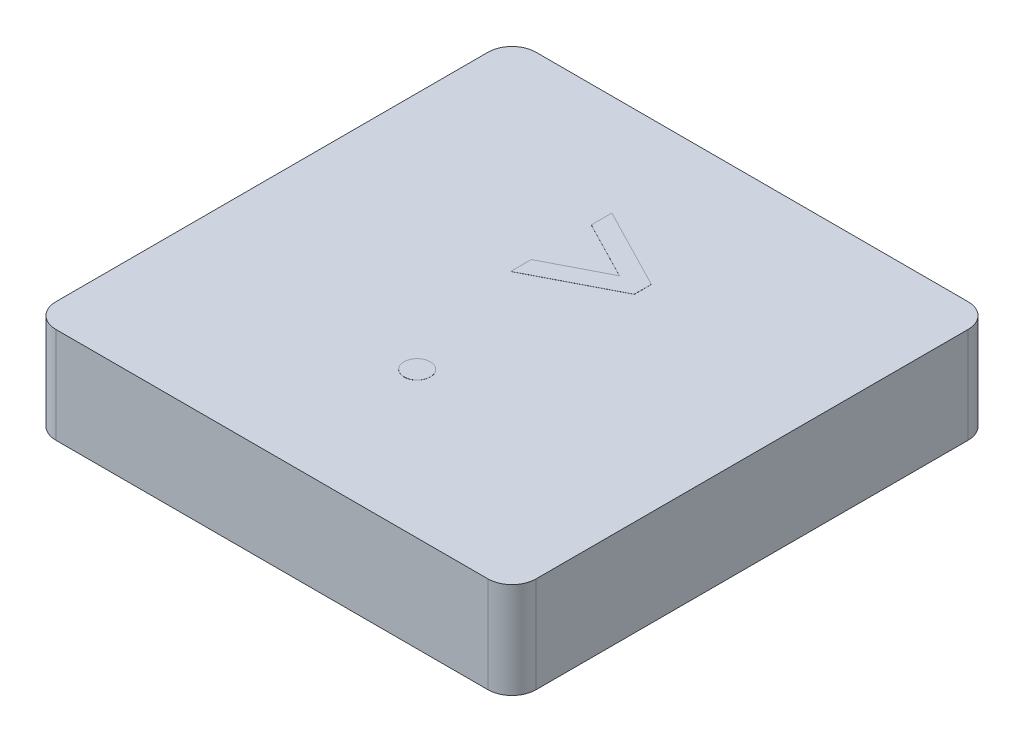
ISO-10303-21;
HEADER;
FILE_DESCRIPTION(('STEP AP214'),'2;1');
FILE_NAME('part.step','',(''),(''),'','','');
FILE_SCHEMA(('AUTOMOTIVE_DESIGN { 1 0 10303 214 1 1 1 1 }'));
ENDSEC;
DATA;
#1=APPLICATION_CONTEXT('core data for automotive mechanical design processes');
#2=APPLICATION_PROTOCOL_DEFINITION('international standard','automotive_design',2000,#1);
#3=PRODUCT_CONTEXT('',#1,'mechanical');
#4=PRODUCT('Part','Part','',(#3));
#5=PRODUCT_RELATED_PRODUCT_CATEGORY('part','',(#4));
#6=PRODUCT_DEFINITION_FORMATION('','',#4);
#7=PRODUCT_DEFINITION_CONTEXT('part definition',#1,'design');
#8=PRODUCT_DEFINITION('design','',#6,#7);
#9=PRODUCT_DEFINITION_SHAPE('','',#8);
#10=(LENGTH_UNIT() NAMED_UNIT(*) SI_UNIT(.MILLI.,.METRE.));
#11=(NAMED_UNIT(*) PLANE_ANGLE_UNIT() SI_UNIT($,.RADIAN.));
#12=(NAMED_UNIT(*) SI_UNIT($,.STERADIAN.) SOLID_ANGLE_UNIT());
#13=UNCERTAINTY_MEASURE_WITH_UNIT(LENGTH_MEASURE(1.E-05),#10,'distance_accuracy_value','');
#14=(GEOMETRIC_REPRESENTATION_CONTEXT(3) GLOBAL_UNCERTAINTY_ASSIGNED_CONTEXT((#13)) GLOBAL_UNIT_ASSIGNED_CONTEXT((#10,
#11,#12)) REPRESENTATION_CONTEXT('',''));
#15=CARTESIAN_POINT('',(0.,0.,0.));
#16=DIRECTION('',(0.,0.,1.));
#17=DIRECTION('',(1.,0.,0.));
#18=AXIS2_PLACEMENT_3D('',#15,#16,#17);
#19=CARTESIAN_POINT('',(0.,2.54,-12.7));
#20=DIRECTION('',(1.,0.,0.));
#21=DIRECTION('',(0.,0.,-1.));
#22=AXIS2_PLACEMENT_3D('',#19,#20,#21);
#23=PLANE('',#22);
#24=DIRECTION('',(0.,0.,1.));
#25=VECTOR('',#24,1.);
#26=CARTESIAN_POINT('',(0.,2.54,-12.7));
#27=LINE('',#26,#25);
#28=CARTESIAN_POINT('',(0.,2.54,-12.065));
#29=VERTEX_POINT('',#28);
#30=CARTESIAN_POINT('',(0.,2.54,-0.635));
#31=VERTEX_POINT('',#30);
#32=EDGE_CURVE('E361',#29,#31,#27,.T.);
#33=ORIENTED_EDGE('',*,*,#32,.F.);
#34=DIRECTION('',(0.,-1.,0.));
#35=VECTOR('',#34,1.);
#36=CARTESIAN_POINT('',(0.,2.54,-12.065));
#37=LINE('',#36,#35);
#38=CARTESIAN_POINT('',(0.,0.,-12.065));
#39=VERTEX_POINT('',#38);
#40=EDGE_CURVE('E382',#29,#39,#37,.T.);
#41=ORIENTED_EDGE('',*,*,#40,.T.);
#42=DIRECTION('',(0.,0.,1.));
#43=VECTOR('',#42,1.);
#44=CARTESIAN_POINT('',(0.,0.,-12.7));
#45=LINE('',#44,#43);
#46=CARTESIAN_POINT('',(0.,0.,-0.635));
#47=VERTEX_POINT('',#46);
#48=EDGE_CURVE('E371',#39,#47,#45,.T.);
#49=ORIENTED_EDGE('',*,*,#48,.T.);
#50=DIRECTION('',(0.,-1.,0.));
#51=VECTOR('',#50,1.);
#52=CARTESIAN_POINT('',(0.,2.54,-0.635));
#53=LINE('',#52,#51);
#54=EDGE_CURVE('E370',#47,#31,#53,.F.);
#55=ORIENTED_EDGE('',*,*,#54,.T.);
#56=EDGE_LOOP('',(#33,#41,#49,#55));
#57=FACE_BOUND('',#56,.T.);
#58=ADVANCED_FACE('F33',(#57),#23,.F.);
#59=CARTESIAN_POINT('',(0.,2.54,0.));
#60=DIRECTION('',(0.,0.,-1.));
#61=DIRECTION('',(-1.,0.,0.));
#62=AXIS2_PLACEMENT_3D('',#59,#60,#61);
#63=PLANE('',#62);
#64=DIRECTION('',(1.,0.,0.));
#65=VECTOR('',#64,1.);
#66=CARTESIAN_POINT('',(0.,0.,0.));
#67=LINE('',#66,#65);
#68=CARTESIAN_POINT('',(0.635,0.,0.));
#69=VERTEX_POINT('',#68);
#70=CARTESIAN_POINT('',(12.065,0.,0.));
#71=VERTEX_POINT('',#70);
#72=EDGE_CURVE('E356',#69,#71,#67,.T.);
#73=ORIENTED_EDGE('',*,*,#72,.T.);
#74=DIRECTION('',(0.,-1.,0.));
#75=VECTOR('',#74,1.);
#76=CARTESIAN_POINT('',(12.065,2.54,0.));
#77=LINE('',#76,#75);
#78=CARTESIAN_POINT('',(12.065,2.54,0.));
#79=VERTEX_POINT('',#78);
#80=EDGE_CURVE('E41',#71,#79,#77,.F.);
#81=ORIENTED_EDGE('',*,*,#80,.T.);
#82=DIRECTION('',(1.,0.,0.));
#83=VECTOR('',#82,1.);
#84=CARTESIAN_POINT('',(0.,2.54,0.));
#85=LINE('',#84,#83);
#86=CARTESIAN_POINT('',(0.635,2.54,0.));
#87=VERTEX_POINT('',#86);
#88=EDGE_CURVE('E353',#87,#79,#85,.T.);
#89=ORIENTED_EDGE('',*,*,#88,.F.);
#90=DIRECTION('',(0.,-1.,0.));
#91=VECTOR('',#90,1.);
#92=CARTESIAN_POINT('',(0.635,2.54,0.));
#93=LINE('',#92,#91);
#94=EDGE_CURVE('E349',#87,#69,#93,.T.);
#95=ORIENTED_EDGE('',*,*,#94,.T.);
#96=EDGE_LOOP('',(#73,#81,#89,#95));
#97=FACE_BOUND('',#96,.T.);
#98=ADVANCED_FACE('F305',(#97),#63,.F.);
#99=CARTESIAN_POINT('',(12.7,2.54,0.));
#100=DIRECTION('',(-1.,0.,0.));
#101=DIRECTION('',(0.,0.,1.));
#102=AXIS2_PLACEMENT_3D('',#99,#100,#101);
#103=PLANE('',#102);
#104=DIRECTION('',(0.,0.,-1.));
#105=VECTOR('',#104,1.);
#106=CARTESIAN_POINT('',(12.7,0.,0.));
#107=LINE('',#106,#105);
#108=CARTESIAN_POINT('',(12.7,0.,-0.635));
#109=VERTEX_POINT('',#108);
#110=CARTESIAN_POINT('',(12.7,0.,-12.065));
#111=VERTEX_POINT('',#110);
#112=EDGE_CURVE('E376',#109,#111,#107,.T.);
#113=ORIENTED_EDGE('',*,*,#112,.T.);
#114=DIRECTION('',(0.,-1.,0.));
#115=VECTOR('',#114,1.);
#116=CARTESIAN_POINT('',(12.7,2.54,-12.065));
#117=LINE('',#116,#115);
#118=CARTESIAN_POINT('',(12.7,2.54,-12.065));
#119=VERTEX_POINT('',#118);
#120=EDGE_CURVE('E347',#111,#119,#117,.F.);
#121=ORIENTED_EDGE('',*,*,#120,.T.);
#122=DIRECTION('',(0.,0.,-1.));
#123=VECTOR('',#122,1.);
#124=CARTESIAN_POINT('',(12.7,2.54,0.));
#125=LINE('',#124,#123);
#126=CARTESIAN_POINT('',(12.7,2.54,-0.635));
#127=VERTEX_POINT('',#126);
#128=EDGE_CURVE('E360',#127,#119,#125,.T.);
#129=ORIENTED_EDGE('',*,*,#128,.F.);
#130=DIRECTION('',(0.,-1.,0.));
#131=VECTOR('',#130,1.);
#132=CARTESIAN_POINT('',(12.7,2.54,-0.635));
#133=LINE('',#132,#131);
#134=EDGE_CURVE('E331',#127,#109,#133,.T.);
#135=ORIENTED_EDGE('',*,*,#134,.T.);
#136=EDGE_LOOP('',(#113,#121,#129,#135));
#137=FACE_BOUND('',#136,.T.);
#138=ADVANCED_FACE('F301',(#137),#103,.F.);
#139=CARTESIAN_POINT('',(12.7,2.54,-12.7));
#140=DIRECTION('',(0.,0.,1.));
#141=DIRECTION('',(1.,0.,0.));
#142=AXIS2_PLACEMENT_3D('',#139,#140,#141);
#143=PLANE('',#142);
#144=DIRECTION('',(-1.,0.,0.));
#145=VECTOR('',#144,1.);
#146=CARTESIAN_POINT('',(12.7,0.,-12.7));
#147=LINE('',#146,#145);
#148=CARTESIAN_POINT('',(12.065,0.,-12.7));
#149=VERTEX_POINT('',#148);
#150=CARTESIAN_POINT('',(0.634999999999995,0.,-12.7));
#151=VERTEX_POINT('',#150);
#152=EDGE_CURVE('E365',#149,#151,#147,.T.);
#153=ORIENTED_EDGE('',*,*,#152,.T.);
#154=DIRECTION('',(0.,-1.,0.));
#155=VECTOR('',#154,1.);
#156=CARTESIAN_POINT('',(0.634999999999995,2.54,-12.7));
#157=LINE('',#156,#155);
#158=CARTESIAN_POINT('',(0.634999999999995,2.54,-12.7));
#159=VERTEX_POINT('',#158);
#160=EDGE_CURVE('E341',#151,#159,#157,.F.);
#161=ORIENTED_EDGE('',*,*,#160,.T.);
#162=DIRECTION('',(-1.,0.,0.));
#163=VECTOR('',#162,1.);
#164=CARTESIAN_POINT('',(12.7,2.54,-12.7));
#165=LINE('',#164,#163);
#166=CARTESIAN_POINT('',(12.065,2.54,-12.7));
#167=VERTEX_POINT('',#166);
#168=EDGE_CURVE('E363',#167,#159,#165,.T.);
#169=ORIENTED_EDGE('',*,*,#168,.F.);
#170=DIRECTION('',(0.,-1.,0.));
#171=VECTOR('',#170,1.);
#172=CARTESIAN_POINT('',(12.065,2.54,-12.7));
#173=LINE('',#172,#171);
#174=EDGE_CURVE('E393',#167,#149,#173,.T.);
#175=ORIENTED_EDGE('',*,*,#174,.T.);
#176=EDGE_LOOP('',(#153,#161,#169,#175));
#177=FACE_BOUND('',#176,.T.);
#178=ADVANCED_FACE('F294',(#177),#143,.F.);
#179=CARTESIAN_POINT('',(0.,2.54,0.));
#180=DIRECTION('',(0.,1.,0.));
#181=DIRECTION('',(0.,0.,1.));
#182=AXIS2_PLACEMENT_3D('',#179,#180,#181);
#183=PLANE('',#182);
#184=CARTESIAN_POINT('',(5.98463076923076,2.54,-3.86256049679487));
#185=CARTESIAN_POINT('',(5.98575091221305,2.54,-3.88582365414126));
#186=CARTESIAN_POINT('',(5.98793947068879,2.54,-3.93127569105815));
#187=CARTESIAN_POINT('',(6.00822733864156,2.54,-3.99624890744085));
#188=CARTESIAN_POINT('',(6.03959142315948,2.54,-4.05621517679641));
#189=CARTESIAN_POINT('',(6.08444342926258,2.54,-4.10822492029485));
#190=CARTESIAN_POINT('',(6.13726718656445,2.54,-4.15192679149887));
#191=CARTESIAN_POINT('',(6.19676588491166,2.54,-4.18484198105881));
#192=CARTESIAN_POINT('',(6.26231006703648,2.54,-4.20356641951964));
#193=CARTESIAN_POINT('',(6.30761382812563,2.54,-4.20603050264023));
#194=CARTESIAN_POINT('',(6.33062435897435,2.54,-4.20728205128205));
#195=B_SPLINE_CURVE_WITH_KNOTS('',3,(#184,#185,#186,#187,#188,#189,#190,#191,#192,#193,#194),
.UNSPECIFIED.,.F.,.F.,(4,1,1,1,1,1,1,1,4),(0.,0.128226026866841,0.250530657557688,
0.372638769720387,0.499833212026497,0.627178614218926,0.749841778857928,0.872940494866994,1.),.UNSPECIFIED.);
#196=CARTESIAN_POINT('',(5.98463076923076,2.54,-3.86256049679487));
#197=VERTEX_POINT('',#196);
#198=CARTESIAN_POINT('',(6.33062435897435,2.54,-4.20728205128205));
#199=VERTEX_POINT('',#198);
#200=EDGE_CURVE('E525',#197,#199,#195,.T.);
#201=ORIENTED_EDGE('',*,*,#200,.T.);
#202=CARTESIAN_POINT('',(6.33062435897435,2.54,-4.20728205128205));
#203=CARTESIAN_POINT('',(6.353629407661,2.54,-4.20602073971902));
#204=CARTESIAN_POINT('',(6.39892237531986,2.54,-4.20353743509269));
#205=CARTESIAN_POINT('',(6.46436453795515,2.54,-4.18500479271068));
#206=CARTESIAN_POINT('',(6.52342646670938,2.54,-4.15170826026923));
#207=CARTESIAN_POINT('',(6.5762357225429,2.54,-4.10827870469958));
#208=CARTESIAN_POINT('',(6.62088989942241,2.54,-4.05602715083426));
#209=CARTESIAN_POINT('',(6.65316492861202,2.54,-3.99644064214387));
#210=CARTESIAN_POINT('',(6.67326339879591,2.54,-3.93125063714047));
#211=CARTESIAN_POINT('',(6.67548228398616,2.54,-3.88581517227294));
#212=CARTESIAN_POINT('',(6.67661794871794,2.54,-3.86256049679487));
#213=B_SPLINE_CURVE_WITH_KNOTS('',3,(#202,#203,#204,#205,#206,#207,#208,#209,#210,#211,#212),
.UNSPECIFIED.,.F.,.F.,(4,1,1,1,1,1,1,1,4),(0.,0.127119625072328,0.250276586919274,
0.37196931255128,0.499374969959128,0.626629596051927,0.749350800441734,0.871713301238153,1.),.UNSPECIFIED.);
#214=CARTESIAN_POINT('',(6.67661794871794,2.54,-3.86256049679487));
#215=VERTEX_POINT('',#214);
#216=EDGE_CURVE('E193',#199,#215,#213,.T.);
#217=ORIENTED_EDGE('',*,*,#216,.T.);
#218=CARTESIAN_POINT('',(6.67661794871794,2.54,-3.86256049679487));
#219=CARTESIAN_POINT('',(6.6754897236794,2.54,-3.8393020865389));
#220=CARTESIAN_POINT('',(6.67328537431536,2.54,-3.79385932458524));
#221=CARTESIAN_POINT('',(6.65302584913333,2.54,-3.72854229205355));
#222=CARTESIAN_POINT('',(6.62093812856149,2.54,-3.66846603671222));
#223=CARTESIAN_POINT('',(6.57623213979147,2.54,-3.61565457315069));
#224=CARTESIAN_POINT('',(6.52364516818723,2.54,-3.57140654682116));
#225=CARTESIAN_POINT('',(6.46422874430364,2.54,-3.53841705712609));
#226=CARTESIAN_POINT('',(6.3990470413914,2.54,-3.51883310499646));
#227=CARTESIAN_POINT('',(6.35365135029394,2.54,-3.51648562992276));
#228=CARTESIAN_POINT('',(6.33062435897435,2.54,-3.51529487179487));
#229=B_SPLINE_CURVE_WITH_KNOTS('',3,(#218,#219,#220,#221,#222,#223,#224,#225,#226,#227,#228),
.UNSPECIFIED.,.F.,.F.,(4,1,1,1,1,1,1,1,4),(0.,0.12790236398313,0.249898278335897,
0.373279763933122,0.501048615318031,0.62881746670294,0.750145612474144,0.873261213264337,1.),.UNSPECIFIED.);
#230=CARTESIAN_POINT('',(6.33062435897435,2.54,-3.51529487179487));
#231=VERTEX_POINT('',#230);
#232=EDGE_CURVE('E53',#215,#231,#229,.T.);
#233=ORIENTED_EDGE('',*,*,#232,.T.);
#234=CARTESIAN_POINT('',(6.33062435897435,2.54,-3.51529487179487));
#235=CARTESIAN_POINT('',(6.30759191144224,2.54,-3.51647594711358));
#236=CARTESIAN_POINT('',(6.26218546390095,2.54,-3.51880433337936));
#237=CARTESIAN_POINT('',(6.19690244059557,2.54,-3.53858213059017));
#238=CARTESIAN_POINT('',(6.13704735854968,2.54,-3.57118629629568));
#239=CARTESIAN_POINT('',(6.08444717416582,2.54,-3.61570824590472));
#240=CARTESIAN_POINT('',(6.03954145895596,2.54,-3.66827902682409));
#241=CARTESIAN_POINT('',(6.00836602201392,2.54,-3.72873184335594));
#242=CARTESIAN_POINT('',(5.9879177849861,2.54,-3.79383469923495));
#243=CARTESIAN_POINT('',(5.9857435706357,2.54,-3.83929374975976));
#244=CARTESIAN_POINT('',(5.98463076923076,2.54,-3.86256049679487));
#245=B_SPLINE_CURVE_WITH_KNOTS('',3,(#234,#235,#236,#237,#238,#239,#240,#241,#242,#243,#244),
.UNSPECIFIED.,.F.,.F.,(4,1,1,1,1,1,1,1,4),(0.,0.126678439723692,0.249735418691582,
0.372030703029209,0.49973871693411,0.627446730839011,0.750220711397104,0.872158537069258,1.),.UNSPECIFIED.);
#246=EDGE_CURVE('E48',#231,#197,#245,.T.);
#247=ORIENTED_EDGE('',*,*,#246,.T.);
#248=EDGE_LOOP('',(#201,#217,#233,#247));
#249=FACE_BOUND('',#248,.T.);
#250=DIRECTION('',(-0.888852232674498,0.,-0.458193963807425));
#251=VECTOR('',#250,1.);
#252=CARTESIAN_POINT('',(6.86402944711538,2.54,-8.67914743589743));
#253=LINE('',#252,#251);
#254=CARTESIAN_POINT('',(6.86402944711538,2.54,-8.67914743589743));
#255=VERTEX_POINT('',#254);
#256=CARTESIAN_POINT('',(5.32423076923076,2.54,-9.47289743589744));
#257=VERTEX_POINT('',#256);
#258=EDGE_CURVE('E486',#255,#257,#253,.T.);
#259=ORIENTED_EDGE('',*,*,#258,.T.);
#260=DIRECTION('',(0.,0.,-1.));
#261=VECTOR('',#260,1.);
#262=CARTESIAN_POINT('',(5.32423076923076,2.54,-9.47289743589744));
#263=LINE('',#262,#261);
#264=CARTESIAN_POINT('',(5.32423076923076,2.54,-10.017328525641));
#265=VERTEX_POINT('',#264);
#266=EDGE_CURVE('E484',#257,#265,#263,.T.);
#267=ORIENTED_EDGE('',*,*,#266,.T.);
#268=DIRECTION('',(0.888803167408494,0.,0.458289133195004));
#269=VECTOR('',#268,1.);
#270=CARTESIAN_POINT('',(5.32423076923076,2.54,-10.017328525641));
#271=LINE('',#270,#269);
#272=CARTESIAN_POINT('',(7.48160256410256,2.54,-8.90493369391026));
#273=VERTEX_POINT('',#272);
#274=EDGE_CURVE('E482',#265,#273,#271,.T.);
#275=ORIENTED_EDGE('',*,*,#274,.T.);
#276=DIRECTION('',(0.,0.,1.));
#277=VECTOR('',#276,1.);
#278=CARTESIAN_POINT('',(7.48160256410256,2.54,-8.90493369391026));
#279=LINE('',#278,#277);
#280=CARTESIAN_POINT('',(7.48160256410256,2.54,-8.45336117788461));
#281=VERTEX_POINT('',#280);
#282=EDGE_CURVE('E480',#273,#281,#279,.T.);
#283=ORIENTED_EDGE('',*,*,#282,.T.);
#284=DIRECTION('',(-0.888909888177266,0.,0.458082100393237));
#285=VECTOR('',#284,1.);
#286=CARTESIAN_POINT('',(7.48160256410256,2.54,-8.45336117788461));
#287=LINE('',#286,#285);
#288=CARTESIAN_POINT('',(5.32423076923077,2.54,-7.34160236378205));
#289=VERTEX_POINT('',#288);
#290=EDGE_CURVE('E478',#281,#289,#287,.T.);
#291=ORIENTED_EDGE('',*,*,#290,.T.);
#292=DIRECTION('',(0.,0.,-1.));
#293=VECTOR('',#292,1.);
#294=CARTESIAN_POINT('',(5.32423076923076,2.54,-7.34160236378205));
#295=LINE('',#294,#293);
#296=CARTESIAN_POINT('',(5.32423076923076,2.54,-7.88539743589743));
#297=VERTEX_POINT('',#296);
#298=EDGE_CURVE('E476',#289,#297,#295,.T.);
#299=ORIENTED_EDGE('',*,*,#298,.T.);
#300=DIRECTION('',(0.888852232674499,0.,-0.458193963807424));
#301=VECTOR('',#300,1.);
#302=CARTESIAN_POINT('',(5.32423076923076,2.54,-7.88539743589743));
#303=LINE('',#302,#301);
#304=EDGE_CURVE('E473',#297,#255,#303,.T.);
#305=ORIENTED_EDGE('',*,*,#304,.T.);
#306=EDGE_LOOP('',(#259,#267,#275,#283,#291,#299,#305));
#307=FACE_BOUND('',#306,.T.);
#308=ORIENTED_EDGE('',*,*,#168,.T.);
#309=CARTESIAN_POINT('',(0.634999999999995,2.54,-12.065));
#310=DIRECTION('',(0.,1.,0.));
#311=DIRECTION('',(0.,0.,1.));
#312=AXIS2_PLACEMENT_3D('',#309,#310,#311);
#313=CIRCLE('',#312,0.635);
#314=EDGE_CURVE('E339',#159,#29,#313,.T.);
#315=ORIENTED_EDGE('',*,*,#314,.T.);
#316=ORIENTED_EDGE('',*,*,#32,.T.);
#317=CARTESIAN_POINT('',(0.635,2.54,-0.635));
#318=DIRECTION('',(0.,1.,0.));
#319=DIRECTION('',(0.,0.,1.));
#320=AXIS2_PLACEMENT_3D('',#317,#318,#319);
#321=CIRCLE('',#320,0.635);
#322=EDGE_CURVE('E337',#31,#87,#321,.T.);
#323=ORIENTED_EDGE('',*,*,#322,.T.);
#324=ORIENTED_EDGE('',*,*,#88,.T.);
#325=CARTESIAN_POINT('',(12.065,2.54,-0.635));
#326=DIRECTION('',(0.,1.,0.));
#327=DIRECTION('',(0.,0.,1.));
#328=AXIS2_PLACEMENT_3D('',#325,#326,#327);
#329=CIRCLE('',#328,0.635);
#330=EDGE_CURVE('E329',#79,#127,#329,.T.);
#331=ORIENTED_EDGE('',*,*,#330,.T.);
#332=ORIENTED_EDGE('',*,*,#128,.T.);
#333=CARTESIAN_POINT('',(12.065,2.54,-12.065));
#334=DIRECTION('',(0.,1.,0.));
#335=DIRECTION('',(0.,0.,1.));
#336=AXIS2_PLACEMENT_3D('',#333,#334,#335);
#337=CIRCLE('',#336,0.635);
#338=EDGE_CURVE('E336',#119,#167,#337,.T.);
#339=ORIENTED_EDGE('',*,*,#338,.T.);
#340=EDGE_LOOP('',(#308,#315,#316,#323,#324,#331,#332,#339));
#341=FACE_BOUND('',#340,.T.);
#342=ADVANCED_FACE('F290',(#249,#307,#341),#183,.T.);
#343=CARTESIAN_POINT('',(0.,0.,0.));
#344=DIRECTION('',(0.,1.,0.));
#345=DIRECTION('',(0.,0.,1.));
#346=AXIS2_PLACEMENT_3D('',#343,#344,#345);
#347=PLANE('',#346);
#348=DIRECTION('',(-1.,0.,0.));
#349=VECTOR('',#348,1.);
#350=CARTESIAN_POINT('',(12.7,0.,-12.065));
#351=LINE('',#350,#349);
#352=CARTESIAN_POINT('',(12.065,0.,-12.065));
#353=VERTEX_POINT('',#352);
#354=CARTESIAN_POINT('',(0.634999999999995,0.,-12.065));
#355=VERTEX_POINT('',#354);
#356=EDGE_CURVE('E434',#353,#355,#351,.T.);
#357=ORIENTED_EDGE('',*,*,#356,.T.);
#358=DIRECTION('',(0.,0.,1.));
#359=VECTOR('',#358,1.);
#360=CARTESIAN_POINT('',(0.634999999999995,0.,-12.7));
#361=LINE('',#360,#359);
#362=CARTESIAN_POINT('',(0.635,0.,-0.635));
#363=VERTEX_POINT('',#362);
#364=EDGE_CURVE('E429',#355,#363,#361,.T.);
#365=ORIENTED_EDGE('',*,*,#364,.T.);
#366=DIRECTION('',(1.,0.,0.));
#367=VECTOR('',#366,1.);
#368=CARTESIAN_POINT('',(0.,0.,-0.635));
#369=LINE('',#368,#367);
#370=CARTESIAN_POINT('',(12.065,0.,-0.635));
#371=VERTEX_POINT('',#370);
#372=EDGE_CURVE('E432',#363,#371,#369,.T.);
#373=ORIENTED_EDGE('',*,*,#372,.T.);
#374=DIRECTION('',(0.,0.,-1.));
#375=VECTOR('',#374,1.);
#376=CARTESIAN_POINT('',(12.065,0.,0.));
#377=LINE('',#376,#375);
#378=EDGE_CURVE('E437',#371,#353,#377,.T.);
#379=ORIENTED_EDGE('',*,*,#378,.T.);
#380=EDGE_LOOP('',(#357,#365,#373,#379));
#381=FACE_BOUND('',#380,.T.);
#382=ORIENTED_EDGE('',*,*,#48,.F.);
#383=CARTESIAN_POINT('',(0.634999999999995,0.,-12.065));
#384=DIRECTION('',(0.,1.,0.));
#385=DIRECTION('',(0.,0.,1.));
#386=AXIS2_PLACEMENT_3D('',#383,#384,#385);
#387=CIRCLE('',#386,0.635);
#388=EDGE_CURVE('E391',#39,#151,#387,.F.);
#389=ORIENTED_EDGE('',*,*,#388,.T.);
#390=ORIENTED_EDGE('',*,*,#152,.F.);
#391=CARTESIAN_POINT('',(12.065,0.,-12.065));
#392=DIRECTION('',(0.,1.,0.));
#393=DIRECTION('',(0.,0.,1.));
#394=AXIS2_PLACEMENT_3D('',#391,#392,#393);
#395=CIRCLE('',#394,0.635);
#396=EDGE_CURVE('E389',#149,#111,#395,.F.);
#397=ORIENTED_EDGE('',*,*,#396,.T.);
#398=ORIENTED_EDGE('',*,*,#112,.F.);
#399=CARTESIAN_POINT('',(12.065,0.,-0.635));
#400=DIRECTION('',(0.,1.,0.));
#401=DIRECTION('',(0.,0.,1.));
#402=AXIS2_PLACEMENT_3D('',#399,#400,#401);
#403=CIRCLE('',#402,0.635);
#404=EDGE_CURVE('E387',#109,#71,#403,.F.);
#405=ORIENTED_EDGE('',*,*,#404,.T.);
#406=ORIENTED_EDGE('',*,*,#72,.F.);
#407=CARTESIAN_POINT('',(0.635,0.,-0.635));
#408=DIRECTION('',(0.,1.,0.));
#409=DIRECTION('',(0.,0.,1.));
#410=AXIS2_PLACEMENT_3D('',#407,#408,#409);
#411=CIRCLE('',#410,0.635);
#412=EDGE_CURVE('E385',#69,#47,#411,.F.);
#413=ORIENTED_EDGE('',*,*,#412,.T.);
#414=EDGE_LOOP('',(#382,#389,#390,#397,#398,#405,#406,#413));
#415=FACE_BOUND('',#414,.T.);
#416=ADVANCED_FACE('F293',(#381,#415),#347,.F.);
#417=CARTESIAN_POINT('',(0.634999999999995,2.54,-12.065));
#418=DIRECTION('',(0.,-1.,0.));
#419=DIRECTION('',(0.,0.,-1.));
#420=AXIS2_PLACEMENT_3D('',#417,#418,#419);
#421=CYLINDRICAL_SURFACE('',#420,0.635);
#422=ORIENTED_EDGE('',*,*,#314,.F.);
#423=ORIENTED_EDGE('',*,*,#160,.F.);
#424=ORIENTED_EDGE('',*,*,#388,.F.);
#425=ORIENTED_EDGE('',*,*,#40,.F.);
#426=EDGE_LOOP('',(#422,#423,#424,#425));
#427=FACE_BOUND('',#426,.T.);
#428=ADVANCED_FACE('F297',(#427),#421,.T.);
#429=CARTESIAN_POINT('',(12.065,2.54,-12.065));
#430=DIRECTION('',(0.,-1.,0.));
#431=DIRECTION('',(0.,0.,-1.));
#432=AXIS2_PLACEMENT_3D('',#429,#430,#431);
#433=CYLINDRICAL_SURFACE('',#432,0.635);
#434=ORIENTED_EDGE('',*,*,#338,.F.);
#435=ORIENTED_EDGE('',*,*,#120,.F.);
#436=ORIENTED_EDGE('',*,*,#396,.F.);
#437=ORIENTED_EDGE('',*,*,#174,.F.);
#438=EDGE_LOOP('',(#434,#435,#436,#437));
#439=FACE_BOUND('',#438,.T.);
#440=ADVANCED_FACE('F315',(#439),#433,.T.);
#441=CARTESIAN_POINT('',(12.065,2.54,-0.635));
#442=DIRECTION('',(0.,-1.,0.));
#443=DIRECTION('',(0.,0.,-1.));
#444=AXIS2_PLACEMENT_3D('',#441,#442,#443);
#445=CYLINDRICAL_SURFACE('',#444,0.635);
#446=ORIENTED_EDGE('',*,*,#330,.F.);
#447=ORIENTED_EDGE('',*,*,#80,.F.);
#448=ORIENTED_EDGE('',*,*,#404,.F.);
#449=ORIENTED_EDGE('',*,*,#134,.F.);
#450=EDGE_LOOP('',(#446,#447,#448,#449));
#451=FACE_BOUND('',#450,.T.);
#452=ADVANCED_FACE('F318',(#451),#445,.T.);
#453=CARTESIAN_POINT('',(0.635,2.54,-0.635));
#454=DIRECTION('',(0.,-1.,0.));
#455=DIRECTION('',(0.,0.,-1.));
#456=AXIS2_PLACEMENT_3D('',#453,#454,#455);
#457=CYLINDRICAL_SURFACE('',#456,0.635);
#458=ORIENTED_EDGE('',*,*,#322,.F.);
#459=ORIENTED_EDGE('',*,*,#54,.F.);
#460=ORIENTED_EDGE('',*,*,#412,.F.);
#461=ORIENTED_EDGE('',*,*,#94,.F.);
#462=EDGE_LOOP('',(#458,#459,#460,#461));
#463=FACE_BOUND('',#462,.T.);
#464=ADVANCED_FACE('F35',(#463),#457,.T.);
#465=CARTESIAN_POINT('',(0.634999999999995,2.54,-12.7));
#466=DIRECTION('',(1.,0.,0.));
#467=DIRECTION('',(0.,0.,-1.));
#468=AXIS2_PLACEMENT_3D('',#465,#466,#467);
#469=PLANE('',#468);
#470=DIRECTION('',(0.,0.,1.));
#471=VECTOR('',#470,1.);
#472=CARTESIAN_POINT('',(0.634999999999995,1.905,-12.7));
#473=LINE('',#472,#471);
#474=CARTESIAN_POINT('',(0.634999999999995,1.905,-12.065));
#475=VERTEX_POINT('',#474);
#476=CARTESIAN_POINT('',(0.635,1.905,-0.635));
#477=VERTEX_POINT('',#476);
#478=EDGE_CURVE('E423',#475,#477,#473,.T.);
#479=ORIENTED_EDGE('',*,*,#478,.T.);
#480=DIRECTION('',(0.,1.,0.));
#481=VECTOR('',#480,1.);
#482=CARTESIAN_POINT('',(0.635,2.54,-0.635));
#483=LINE('',#482,#481);
#484=EDGE_CURVE('E419',#363,#477,#483,.T.);
#485=ORIENTED_EDGE('',*,*,#484,.F.);
#486=ORIENTED_EDGE('',*,*,#364,.F.);
#487=DIRECTION('',(0.,1.,0.));
#488=VECTOR('',#487,1.);
#489=CARTESIAN_POINT('',(0.634999999999995,2.54,-12.065));
#490=LINE('',#489,#488);
#491=EDGE_CURVE('E415',#355,#475,#490,.T.);
#492=ORIENTED_EDGE('',*,*,#491,.T.);
#493=EDGE_LOOP('',(#479,#485,#486,#492));
#494=FACE_BOUND('',#493,.T.);
#495=ADVANCED_FACE('F271',(#494),#469,.T.);
#496=CARTESIAN_POINT('',(0.,2.54,-0.635));
#497=DIRECTION('',(0.,0.,-1.));
#498=DIRECTION('',(-1.,0.,0.));
#499=AXIS2_PLACEMENT_3D('',#496,#497,#498);
#500=PLANE('',#499);
#501=ORIENTED_EDGE('',*,*,#372,.F.);
#502=ORIENTED_EDGE('',*,*,#484,.T.);
#503=DIRECTION('',(1.,0.,0.));
#504=VECTOR('',#503,1.);
#505=CARTESIAN_POINT('',(0.,1.905,-0.635));
#506=LINE('',#505,#504);
#507=CARTESIAN_POINT('',(12.065,1.905,-0.635));
#508=VERTEX_POINT('',#507);
#509=EDGE_CURVE('E421',#477,#508,#506,.T.);
#510=ORIENTED_EDGE('',*,*,#509,.T.);
#511=DIRECTION('',(0.,1.,0.));
#512=VECTOR('',#511,1.);
#513=CARTESIAN_POINT('',(12.065,2.54,-0.635));
#514=LINE('',#513,#512);
#515=EDGE_CURVE('E374',#371,#508,#514,.T.);
#516=ORIENTED_EDGE('',*,*,#515,.F.);
#517=EDGE_LOOP('',(#501,#502,#510,#516));
#518=FACE_BOUND('',#517,.T.);
#519=ADVANCED_FACE('F274',(#518),#500,.T.);
#520=CARTESIAN_POINT('',(12.065,2.54,0.));
#521=DIRECTION('',(-1.,0.,0.));
#522=DIRECTION('',(0.,0.,1.));
#523=AXIS2_PLACEMENT_3D('',#520,#521,#522);
#524=PLANE('',#523);
#525=ORIENTED_EDGE('',*,*,#378,.F.);
#526=ORIENTED_EDGE('',*,*,#515,.T.);
#527=DIRECTION('',(0.,0.,-1.));
#528=VECTOR('',#527,1.);
#529=CARTESIAN_POINT('',(12.065,1.905,0.));
#530=LINE('',#529,#528);
#531=CARTESIAN_POINT('',(12.065,1.905,-12.065));
#532=VERTEX_POINT('',#531);
#533=EDGE_CURVE('E422',#508,#532,#530,.T.);
#534=ORIENTED_EDGE('',*,*,#533,.T.);
#535=DIRECTION('',(0.,1.,0.));
#536=VECTOR('',#535,1.);
#537=CARTESIAN_POINT('',(12.065,2.54,-12.065));
#538=LINE('',#537,#536);
#539=EDGE_CURVE('E409',#353,#532,#538,.T.);
#540=ORIENTED_EDGE('',*,*,#539,.F.);
#541=EDGE_LOOP('',(#525,#526,#534,#540));
#542=FACE_BOUND('',#541,.T.);
#543=ADVANCED_FACE('F278',(#542),#524,.T.);
#544=CARTESIAN_POINT('',(12.7,2.54,-12.065));
#545=DIRECTION('',(0.,0.,1.));
#546=DIRECTION('',(1.,0.,0.));
#547=AXIS2_PLACEMENT_3D('',#544,#545,#546);
#548=PLANE('',#547);
#549=ORIENTED_EDGE('',*,*,#356,.F.);
#550=ORIENTED_EDGE('',*,*,#539,.T.);
#551=DIRECTION('',(-1.,0.,0.));
#552=VECTOR('',#551,1.);
#553=CARTESIAN_POINT('',(12.7,1.905,-12.065));
#554=LINE('',#553,#552);
#555=EDGE_CURVE('E426',#532,#475,#554,.T.);
#556=ORIENTED_EDGE('',*,*,#555,.T.);
#557=ORIENTED_EDGE('',*,*,#491,.F.);
#558=EDGE_LOOP('',(#549,#550,#556,#557));
#559=FACE_BOUND('',#558,.T.);
#560=ADVANCED_FACE('F282',(#559),#548,.T.);
#561=CARTESIAN_POINT('',(0.,1.905,0.));
#562=DIRECTION('',(0.,1.,0.));
#563=DIRECTION('',(0.,0.,1.));
#564=AXIS2_PLACEMENT_3D('',#561,#562,#563);
#565=PLANE('',#564);
#566=CARTESIAN_POINT('',(6.34999999999999,1.905,-6.35));
#567=DIRECTION('',(0.,1.,0.));
#568=DIRECTION('',(0.,0.,1.));
#569=AXIS2_PLACEMENT_3D('',#566,#567,#568);
#570=CIRCLE('',#569,2.54);
#571=CARTESIAN_POINT('',(6.34999999999999,1.905,-3.81));
#572=VERTEX_POINT('',#571);
#573=EDGE_CURVE('E11',#572,#572,#570,.F.);
#574=ORIENTED_EDGE('',*,*,#573,.F.);
#575=EDGE_LOOP('',(#574));
#576=FACE_BOUND('',#575,.T.);
#577=ORIENTED_EDGE('',*,*,#555,.F.);
#578=ORIENTED_EDGE('',*,*,#533,.F.);
#579=ORIENTED_EDGE('',*,*,#509,.F.);
#580=ORIENTED_EDGE('',*,*,#478,.F.);
#581=EDGE_LOOP('',(#577,#578,#579,#580));
#582=FACE_BOUND('',#581,.T.);
#583=ADVANCED_FACE('F269',(#576,#582),#565,.F.);
#584=CARTESIAN_POINT('',(6.34999999999999,-7.18420489685532,-6.35));
#585=DIRECTION('',(0.,1.,0.));
#586=DIRECTION('',(0.,0.,1.));
#587=AXIS2_PLACEMENT_3D('',#584,#585,#586);
#588=CYLINDRICAL_SURFACE('',#587,2.54);
#589=CARTESIAN_POINT('',(6.34999999999999,0.,-6.35));
#590=DIRECTION('',(0.,1.,0.));
#591=DIRECTION('',(0.,0.,1.));
#592=AXIS2_PLACEMENT_3D('',#589,#590,#591);
#593=CIRCLE('',#592,2.54);
#594=CARTESIAN_POINT('',(6.34999999999999,0.,-3.81));
#595=VERTEX_POINT('',#594);
#596=EDGE_CURVE('E433',#595,#595,#593,.T.);
#597=CARTESIAN_POINT('',(6.34999999999999,0.,-3.81));
#598=CARTESIAN_POINT('',(6.34999999999999,0.0198437499999991,-3.81));
#599=CARTESIAN_POINT('',(6.34999999999999,0.0396874999999989,-3.81));
#600=CARTESIAN_POINT('',(6.34999999999999,0.079374999999999,-3.81));
#601=CARTESIAN_POINT('',(6.34999999999999,0.0992187499999992,-3.81));
#602=CARTESIAN_POINT('',(6.34999999999999,0.138906249999999,-3.81));
#603=CARTESIAN_POINT('',(6.34999999999999,0.158749999999999,-3.81));
#604=CARTESIAN_POINT('',(6.34999999999999,0.198437499999999,-3.81));
#605=CARTESIAN_POINT('',(6.34999999999999,0.218281249999999,-3.81));
#606=CARTESIAN_POINT('',(6.34999999999999,0.25796875,-3.81));
#607=CARTESIAN_POINT('',(6.34999999999999,0.277812499999999,-3.81));
#608=CARTESIAN_POINT('',(6.34999999999999,0.317499999999999,-3.81));
#609=CARTESIAN_POINT('',(6.34999999999999,0.337343749999999,-3.81));
#610=CARTESIAN_POINT('',(6.34999999999999,0.377031249999999,-3.81));
#611=CARTESIAN_POINT('',(6.34999999999999,0.396874999999999,-3.81));
#612=CARTESIAN_POINT('',(6.34999999999999,0.436562499999999,-3.81));
#613=CARTESIAN_POINT('',(6.34999999999999,0.456406249999999,-3.81));
#614=CARTESIAN_POINT('',(6.34999999999999,0.496093749999999,-3.81));
#615=CARTESIAN_POINT('',(6.34999999999999,0.515937499999999,-3.81));
#616=CARTESIAN_POINT('',(6.34999999999999,0.555624999999999,-3.81));
#617=CARTESIAN_POINT('',(6.34999999999999,0.575468749999999,-3.81));
#618=CARTESIAN_POINT('',(6.34999999999999,0.615156249999999,-3.81));
#619=CARTESIAN_POINT('',(6.34999999999999,0.634999999999999,-3.81));
#620=CARTESIAN_POINT('',(6.34999999999999,0.674687499999998,-3.81));
#621=CARTESIAN_POINT('',(6.34999999999999,0.694531249999998,-3.81));
#622=CARTESIAN_POINT('',(6.34999999999999,0.734218749999998,-3.81));
#623=CARTESIAN_POINT('',(6.34999999999999,0.754062499999998,-3.81));
#624=CARTESIAN_POINT('',(6.34999999999999,0.793749999999998,-3.81));
#625=CARTESIAN_POINT('',(6.34999999999999,0.813593749999999,-3.81));
#626=CARTESIAN_POINT('',(6.34999999999999,0.853281249999999,-3.81));
#627=CARTESIAN_POINT('',(6.34999999999999,0.873124999999999,-3.81));
#628=CARTESIAN_POINT('',(6.34999999999999,0.912812499999999,-3.81));
#629=CARTESIAN_POINT('',(6.34999999999999,0.932656249999999,-3.81));
#630=CARTESIAN_POINT('',(6.34999999999999,0.972343749999998,-3.81));
#631=CARTESIAN_POINT('',(6.34999999999999,0.992187499999998,-3.81));
#632=CARTESIAN_POINT('',(6.34999999999999,1.031875,-3.81));
#633=CARTESIAN_POINT('',(6.34999999999999,1.05171875,-3.81));
#634=CARTESIAN_POINT('',(6.34999999999999,1.09140625,-3.81));
#635=CARTESIAN_POINT('',(6.34999999999999,1.11125,-3.81));
#636=CARTESIAN_POINT('',(6.34999999999999,1.1509375,-3.81));
#637=CARTESIAN_POINT('',(6.34999999999999,1.17078125,-3.81));
#638=CARTESIAN_POINT('',(6.34999999999999,1.21046875,-3.81));
#639=CARTESIAN_POINT('',(6.34999999999999,1.2303125,-3.81));
#640=CARTESIAN_POINT('',(6.34999999999999,1.27,-3.81));
#641=CARTESIAN_POINT('',(6.34999999999999,1.28984375,-3.81));
#642=CARTESIAN_POINT('',(6.34999999999999,1.32953125,-3.81));
#643=CARTESIAN_POINT('',(6.34999999999999,1.349375,-3.81));
#644=CARTESIAN_POINT('',(6.34999999999999,1.3890625,-3.81));
#645=CARTESIAN_POINT('',(6.34999999999999,1.40890625,-3.81));
#646=CARTESIAN_POINT('',(6.34999999999999,1.44859375,-3.81));
#647=CARTESIAN_POINT('',(6.34999999999999,1.4684375,-3.81));
#648=CARTESIAN_POINT('',(6.34999999999999,1.508125,-3.81));
#649=CARTESIAN_POINT('',(6.34999999999999,1.52796875,-3.81));
#650=CARTESIAN_POINT('',(6.34999999999999,1.56765625,-3.81));
#651=CARTESIAN_POINT('',(6.34999999999999,1.5875,-3.81));
#652=CARTESIAN_POINT('',(6.34999999999999,1.6271875,-3.81));
#653=CARTESIAN_POINT('',(6.34999999999999,1.64703125,-3.81));
#654=CARTESIAN_POINT('',(6.34999999999999,1.68671875,-3.81));
#655=CARTESIAN_POINT('',(6.34999999999999,1.7065625,-3.81));
#656=CARTESIAN_POINT('',(6.34999999999999,1.74625,-3.81));
#657=CARTESIAN_POINT('',(6.34999999999999,1.76609375,-3.81));
#658=CARTESIAN_POINT('',(6.34999999999999,1.80578125,-3.81));
#659=CARTESIAN_POINT('',(6.34999999999999,1.825625,-3.81));
#660=CARTESIAN_POINT('',(6.34999999999999,1.8653125,-3.81));
#661=CARTESIAN_POINT('',(6.34999999999999,1.88515625,-3.81));
#662=CARTESIAN_POINT('',(6.34999999999999,1.905,-3.81));
#663=B_SPLINE_CURVE_WITH_KNOTS('',3,(#597,#598,#599,#600,#601,#602,#603,#604,#605,#606,#607,
#608,#609,#610,#611,#612,#613,#614,#615,#616,#617,#618,#619,#620,#621,#622,#623,#624,#625,#626,
#627,#628,#629,#630,#631,#632,#633,#634,#635,#636,#637,#638,#639,#640,#641,#642,#643,#644,#645,
#646,#647,#648,#649,#650,#651,#652,#653,#654,#655,#656,#657,#658,#659,#660,#661,#662),
.UNSPECIFIED.,.F.,.F.,(4,2,2,2,2,2,2,2,2,2,2,2,2,2,2,2,2,2,2,2,2,2,2,2,2,2,2,2,2,2,2,2,4),(0.,
0.0595312499999997,0.1190625,0.17859375,0.238125,0.29765625,0.3571875,0.41671875,0.47625,
0.53578125,0.5953125,0.654843749999999,0.714374999999999,0.773906249999999,0.8334375,0.89296875,
0.952499999999999,1.01203125,1.0715625,1.13109375,1.190625,1.25015625,1.3096875,1.36921875,
1.42875,1.48828125,1.5478125,1.60734375,1.666875,1.72640625,1.7859375,1.84546875,1.905),.UNSPECIFIED.);
#664=EDGE_CURVE('BSEAM265',#595,#572,#663,.T.);
#665=ORIENTED_EDGE('',*,*,#596,.T.);
#666=ORIENTED_EDGE('',*,*,#573,.T.);
#667=ORIENTED_EDGE('',*,*,#664,.T.);
#668=ORIENTED_EDGE('',*,*,#664,.F.);
#669=EDGE_LOOP('',(#665,#667,#666,#668));
#670=FACE_BOUND('',#669,.T.);
#671=ADVANCED_FACE('F265',(#670),#588,.T.);
#672=CARTESIAN_POINT('',(0.,0.,0.));
#673=DIRECTION('',(0.,1.,0.));
#674=DIRECTION('',(0.,0.,1.));
#675=AXIS2_PLACEMENT_3D('',#672,#673,#674);
#676=PLANE('',#675);
#677=ORIENTED_EDGE('',*,*,#596,.F.);
#678=EDGE_LOOP('',(#677));
#679=FACE_BOUND('',#678,.T.);
#680=ADVANCED_FACE('F261',(#679),#676,.F.);
#681=CARTESIAN_POINT('',(6.86402944711538,2.54254,-8.67914743589743));
#682=DIRECTION('',(-0.458193963807425,0.,0.888852232674498));
#683=DIRECTION('',(0.888852232674498,0.,0.458193963807425));
#684=AXIS2_PLACEMENT_3D('',#681,#682,#683);
#685=PLANE('',#684);
#686=ORIENTED_EDGE('',*,*,#258,.F.);
#687=DIRECTION('',(0.,-1.,0.));
#688=VECTOR('',#687,1.);
#689=CARTESIAN_POINT('',(6.86402944711538,2.54254,-8.67914743589743));
#690=LINE('',#689,#688);
#691=CARTESIAN_POINT('',(6.86402944711538,2.54254,-8.67914743589743));
#692=VERTEX_POINT('',#691);
#693=EDGE_CURVE('E451',#692,#255,#690,.T.);
#694=ORIENTED_EDGE('',*,*,#693,.F.);
#695=DIRECTION('',(-0.888852232674498,0.,-0.458193963807425));
#696=VECTOR('',#695,1.);
#697=CARTESIAN_POINT('',(6.86402944711538,2.54254,-8.67914743589743));
#698=LINE('',#697,#696);
#699=CARTESIAN_POINT('',(5.32423076923076,2.54254,-9.47289743589744));
#700=VERTEX_POINT('',#699);
#701=EDGE_CURVE('E475',#692,#700,#698,.T.);
#702=ORIENTED_EDGE('',*,*,#701,.T.);
#703=DIRECTION('',(0.,-1.,0.));
#704=VECTOR('',#703,1.);
#705=CARTESIAN_POINT('',(5.32423076923076,2.54254,-9.47289743589744));
#706=LINE('',#705,#704);
#707=EDGE_CURVE('E452',#700,#257,#706,.T.);
#708=ORIENTED_EDGE('',*,*,#707,.T.);
#709=EDGE_LOOP('',(#686,#694,#702,#708));
#710=FACE_BOUND('',#709,.T.);
#711=ADVANCED_FACE('F239',(#710),#685,.T.);
#712=CARTESIAN_POINT('',(5.32423076923076,2.54254,-7.88539743589743));
#713=DIRECTION('',(-0.458193963807424,0.,-0.888852232674499));
#714=DIRECTION('',(-0.888852232674499,0.,0.458193963807424));
#715=AXIS2_PLACEMENT_3D('',#712,#713,#714);
#716=PLANE('',#715);
#717=ORIENTED_EDGE('',*,*,#304,.F.);
#718=DIRECTION('',(0.,-1.,0.));
#719=VECTOR('',#718,1.);
#720=CARTESIAN_POINT('',(5.32423076923076,2.54254,-7.88539743589743));
#721=LINE('',#720,#719);
#722=CARTESIAN_POINT('',(5.32423076923076,2.54254,-7.88539743589743));
#723=VERTEX_POINT('',#722);
#724=EDGE_CURVE('E468',#723,#297,#721,.T.);
#725=ORIENTED_EDGE('',*,*,#724,.F.);
#726=DIRECTION('',(0.888852232674499,0.,-0.458193963807424));
#727=VECTOR('',#726,1.);
#728=CARTESIAN_POINT('',(5.32423076923076,2.54254,-7.88539743589743));
#729=LINE('',#728,#727);
#730=EDGE_CURVE('E456',#723,#692,#729,.T.);
#731=ORIENTED_EDGE('',*,*,#730,.T.);
#732=ORIENTED_EDGE('',*,*,#693,.T.);
#733=EDGE_LOOP('',(#717,#725,#731,#732));
#734=FACE_BOUND('',#733,.T.);
#735=ADVANCED_FACE('F235',(#734),#716,.T.);
#736=CARTESIAN_POINT('',(5.32423076923076,2.54254,-7.34160236378205));
#737=DIRECTION('',(-1.,0.,0.));
#738=DIRECTION('',(0.,0.,1.));
#739=AXIS2_PLACEMENT_3D('',#736,#737,#738);
#740=PLANE('',#739);
#741=ORIENTED_EDGE('',*,*,#298,.F.);
#742=DIRECTION('',(0.,-1.,0.));
#743=VECTOR('',#742,1.);
#744=CARTESIAN_POINT('',(5.32423076923076,2.54254,-7.34160236378205));
#745=LINE('',#744,#743);
#746=CARTESIAN_POINT('',(5.32423076923076,2.54254,-7.34160236378205));
#747=VERTEX_POINT('',#746);
#748=EDGE_CURVE('E465',#747,#289,#745,.T.);
#749=ORIENTED_EDGE('',*,*,#748,.F.);
#750=DIRECTION('',(0.,0.,-1.));
#751=VECTOR('',#750,1.);
#752=CARTESIAN_POINT('',(5.32423076923076,2.54254,-7.34160236378205));
#753=LINE('',#752,#751);
#754=EDGE_CURVE('E490',#747,#723,#753,.T.);
#755=ORIENTED_EDGE('',*,*,#754,.T.);
#756=ORIENTED_EDGE('',*,*,#724,.T.);
#757=EDGE_LOOP('',(#741,#749,#755,#756));
#758=FACE_BOUND('',#757,.T.);
#759=ADVANCED_FACE('F238',(#758),#740,.T.);
#760=CARTESIAN_POINT('',(7.48160256410256,2.54254,-8.45336117788461));
#761=DIRECTION('',(0.458082100393237,0.,0.888909888177266));
#762=DIRECTION('',(0.888909888177266,0.,-0.458082100393237));
#763=AXIS2_PLACEMENT_3D('',#760,#761,#762);
#764=PLANE('',#763);
#765=ORIENTED_EDGE('',*,*,#290,.F.);
#766=DIRECTION('',(0.,-1.,0.));
#767=VECTOR('',#766,1.);
#768=CARTESIAN_POINT('',(7.48160256410256,2.54254,-8.45336117788461));
#769=LINE('',#768,#767);
#770=CARTESIAN_POINT('',(7.48160256410256,2.54254,-8.45336117788461));
#771=VERTEX_POINT('',#770);
#772=EDGE_CURVE('E462',#771,#281,#769,.T.);
#773=ORIENTED_EDGE('',*,*,#772,.F.);
#774=DIRECTION('',(-0.888909888177266,0.,0.458082100393237));
#775=VECTOR('',#774,1.);
#776=CARTESIAN_POINT('',(7.48160256410256,2.54254,-8.45336117788461));
#777=LINE('',#776,#775);
#778=EDGE_CURVE('E493',#771,#747,#777,.T.);
#779=ORIENTED_EDGE('',*,*,#778,.T.);
#780=ORIENTED_EDGE('',*,*,#748,.T.);
#781=EDGE_LOOP('',(#765,#773,#779,#780));
#782=FACE_BOUND('',#781,.T.);
#783=ADVANCED_FACE('F243',(#782),#764,.T.);
#784=CARTESIAN_POINT('',(7.48160256410256,2.54254,-8.90493369391026));
#785=DIRECTION('',(1.,0.,0.));
#786=DIRECTION('',(0.,0.,-1.));
#787=AXIS2_PLACEMENT_3D('',#784,#785,#786);
#788=PLANE('',#787);
#789=ORIENTED_EDGE('',*,*,#282,.F.);
#790=DIRECTION('',(0.,-1.,0.));
#791=VECTOR('',#790,1.);
#792=CARTESIAN_POINT('',(7.48160256410256,2.54254,-8.90493369391026));
#793=LINE('',#792,#791);
#794=CARTESIAN_POINT('',(7.48160256410256,2.54254,-8.90493369391026));
#795=VERTEX_POINT('',#794);
#796=EDGE_CURVE('E459',#795,#273,#793,.T.);
#797=ORIENTED_EDGE('',*,*,#796,.F.);
#798=DIRECTION('',(0.,0.,1.));
#799=VECTOR('',#798,1.);
#800=CARTESIAN_POINT('',(7.48160256410256,2.54254,-8.90493369391026));
#801=LINE('',#800,#799);
#802=EDGE_CURVE('E496',#795,#771,#801,.T.);
#803=ORIENTED_EDGE('',*,*,#802,.T.);
#804=ORIENTED_EDGE('',*,*,#772,.T.);
#805=EDGE_LOOP('',(#789,#797,#803,#804));
#806=FACE_BOUND('',#805,.T.);
#807=ADVANCED_FACE('F247',(#806),#788,.T.);
#808=CARTESIAN_POINT('',(5.32423076923076,2.54254,-10.017328525641));
#809=DIRECTION('',(0.458289133195004,0.,-0.888803167408494));
#810=DIRECTION('',(-0.888803167408494,0.,-0.458289133195004));
#811=AXIS2_PLACEMENT_3D('',#808,#809,#810);
#812=PLANE('',#811);
#813=ORIENTED_EDGE('',*,*,#274,.F.);
#814=DIRECTION('',(0.,-1.,0.));
#815=VECTOR('',#814,1.);
#816=CARTESIAN_POINT('',(5.32423076923076,2.54254,-10.017328525641));
#817=LINE('',#816,#815);
#818=CARTESIAN_POINT('',(5.32423076923076,2.54254,-10.017328525641));
#819=VERTEX_POINT('',#818);
#820=EDGE_CURVE('E455',#819,#265,#817,.T.);
#821=ORIENTED_EDGE('',*,*,#820,.F.);
#822=DIRECTION('',(0.888803167408494,0.,0.458289133195004));
#823=VECTOR('',#822,1.);
#824=CARTESIAN_POINT('',(5.32423076923076,2.54254,-10.017328525641));
#825=LINE('',#824,#823);
#826=EDGE_CURVE('E499',#819,#795,#825,.T.);
#827=ORIENTED_EDGE('',*,*,#826,.T.);
#828=ORIENTED_EDGE('',*,*,#796,.T.);
#829=EDGE_LOOP('',(#813,#821,#827,#828));
#830=FACE_BOUND('',#829,.T.);
#831=ADVANCED_FACE('F251',(#830),#812,.T.);
#832=CARTESIAN_POINT('',(5.32423076923076,2.54254,-9.47289743589744));
#833=DIRECTION('',(-1.,0.,0.));
#834=DIRECTION('',(0.,0.,1.));
#835=AXIS2_PLACEMENT_3D('',#832,#833,#834);
#836=PLANE('',#835);
#837=ORIENTED_EDGE('',*,*,#266,.F.);
#838=ORIENTED_EDGE('',*,*,#707,.F.);
#839=DIRECTION('',(0.,0.,-1.));
#840=VECTOR('',#839,1.);
#841=CARTESIAN_POINT('',(5.32423076923076,2.54254,-9.47289743589744));
#842=LINE('',#841,#840);
#843=EDGE_CURVE('E502',#700,#819,#842,.T.);
#844=ORIENTED_EDGE('',*,*,#843,.T.);
#845=ORIENTED_EDGE('',*,*,#820,.T.);
#846=EDGE_LOOP('',(#837,#838,#844,#845));
#847=FACE_BOUND('',#846,.T.);
#848=ADVANCED_FACE('F233',(#847),#836,.T.);
#849=CARTESIAN_POINT('',(0.,2.54254,0.));
#850=DIRECTION('',(0.,-1.,0.));
#851=DIRECTION('',(0.,0.,-1.));
#852=AXIS2_PLACEMENT_3D('',#849,#850,#851);
#853=PLANE('',#852);
#854=ORIENTED_EDGE('',*,*,#701,.F.);
#855=ORIENTED_EDGE('',*,*,#730,.F.);
#856=ORIENTED_EDGE('',*,*,#754,.F.);
#857=ORIENTED_EDGE('',*,*,#778,.F.);
#858=ORIENTED_EDGE('',*,*,#802,.F.);
#859=ORIENTED_EDGE('',*,*,#826,.F.);
#860=ORIENTED_EDGE('',*,*,#843,.F.);
#861=EDGE_LOOP('',(#854,#855,#856,#857,#858,#859,#860));
#862=FACE_BOUND('',#861,.T.);
#863=ADVANCED_FACE('F229',(#862),#853,.F.);
#864=CARTESIAN_POINT('',(5.98463076923076,2.54254,-3.86256049679487));
#865=CARTESIAN_POINT('',(5.98575091221305,2.54254,-3.88582365414126));
#866=CARTESIAN_POINT('',(5.98793947068879,2.54254,-3.93127569105815));
#867=CARTESIAN_POINT('',(6.00822733864156,2.54254,-3.99624890744085));
#868=CARTESIAN_POINT('',(6.03959142315948,2.54254,-4.05621517679641));
#869=CARTESIAN_POINT('',(6.08444342926258,2.54254,-4.10822492029485));
#870=CARTESIAN_POINT('',(6.13726718656445,2.54254,-4.15192679149887));
#871=CARTESIAN_POINT('',(6.19676588491166,2.54254,-4.18484198105881));
#872=CARTESIAN_POINT('',(6.26231006703648,2.54254,-4.20356641951964));
#873=CARTESIAN_POINT('',(6.30761382812563,2.54254,-4.20603050264023));
#874=CARTESIAN_POINT('',(6.33062435897435,2.54254,-4.20728205128205));
#875=B_SPLINE_CURVE_WITH_KNOTS('',3,(#864,#865,#866,#867,#868,#869,#870,#871,#872,#873,#874),
.UNSPECIFIED.,.F.,.F.,(4,1,1,1,1,1,1,1,4),(0.,0.128226026866841,0.250530657557688,
0.372638769720387,0.499833212026497,0.627178614218926,0.749841778857928,0.872940494866994,1.),.UNSPECIFIED.);
#876=DIRECTION('',(0.,-1.,0.));
#877=VECTOR('',#876,1.);
#878=SURFACE_OF_LINEAR_EXTRUSION('',#875,#877);
#879=ORIENTED_EDGE('',*,*,#200,.F.);
#880=DIRECTION('',(0.,-1.,0.));
#881=VECTOR('',#880,1.);
#882=CARTESIAN_POINT('',(5.98463076923076,2.54254,-3.86256049679487));
#883=LINE('',#882,#881);
#884=CARTESIAN_POINT('',(5.98463076923076,2.54254,-3.86256049679487));
#885=VERTEX_POINT('',#884);
#886=EDGE_CURVE('E211',#885,#197,#883,.T.);
#887=ORIENTED_EDGE('',*,*,#886,.F.);
#888=CARTESIAN_POINT('',(6.33062435897435,2.54254,-4.20728205128205));
#889=VERTEX_POINT('',#888);
#890=EDGE_CURVE('E205',#885,#889,#875,.T.);
#891=ORIENTED_EDGE('',*,*,#890,.T.);
#892=DIRECTION('',(0.,-1.,0.));
#893=VECTOR('',#892,1.);
#894=CARTESIAN_POINT('',(6.33062435897435,2.54254,-4.20728205128205));
#895=LINE('',#894,#893);
#896=EDGE_CURVE('E188',#889,#199,#895,.T.);
#897=ORIENTED_EDGE('',*,*,#896,.T.);
#898=EDGE_LOOP('',(#879,#887,#891,#897));
#899=FACE_BOUND('',#898,.T.);
#900=ADVANCED_FACE('F210',(#899),#878,.T.);
#901=CARTESIAN_POINT('',(6.33062435897435,2.54254,-3.51529487179487));
#902=CARTESIAN_POINT('',(6.30759191144224,2.54254,-3.51647594711358));
#903=CARTESIAN_POINT('',(6.26218546390095,2.54254,-3.51880433337936));
#904=CARTESIAN_POINT('',(6.19690244059557,2.54254,-3.53858213059017));
#905=CARTESIAN_POINT('',(6.13704735854968,2.54254,-3.57118629629568));
#906=CARTESIAN_POINT('',(6.08444717416582,2.54254,-3.61570824590472));
#907=CARTESIAN_POINT('',(6.03954145895596,2.54254,-3.66827902682409));
#908=CARTESIAN_POINT('',(6.00836602201392,2.54254,-3.72873184335594));
#909=CARTESIAN_POINT('',(5.9879177849861,2.54254,-3.79383469923495));
#910=CARTESIAN_POINT('',(5.9857435706357,2.54254,-3.83929374975976));
#911=CARTESIAN_POINT('',(5.98463076923076,2.54254,-3.86256049679487));
#912=B_SPLINE_CURVE_WITH_KNOTS('',3,(#901,#902,#903,#904,#905,#906,#907,#908,#909,#910,#911),
.UNSPECIFIED.,.F.,.F.,(4,1,1,1,1,1,1,1,4),(0.,0.126678439723692,0.249735418691582,
0.372030703029209,0.49973871693411,0.627446730839011,0.750220711397104,0.872158537069258,1.),.UNSPECIFIED.);
#913=DIRECTION('',(0.,-1.,0.));
#914=VECTOR('',#913,1.);
#915=SURFACE_OF_LINEAR_EXTRUSION('',#912,#914);
#916=ORIENTED_EDGE('',*,*,#246,.F.);
#917=DIRECTION('',(0.,-1.,0.));
#918=VECTOR('',#917,1.);
#919=CARTESIAN_POINT('',(6.33062435897435,2.54254,-3.51529487179487));
#920=LINE('',#919,#918);
#921=CARTESIAN_POINT('',(6.33062435897435,2.54254,-3.51529487179487));
#922=VERTEX_POINT('',#921);
#923=EDGE_CURVE('E508',#922,#231,#920,.T.);
#924=ORIENTED_EDGE('',*,*,#923,.F.);
#925=EDGE_CURVE('E198',#922,#885,#912,.T.);
#926=ORIENTED_EDGE('',*,*,#925,.T.);
#927=ORIENTED_EDGE('',*,*,#886,.T.);
#928=EDGE_LOOP('',(#916,#924,#926,#927));
#929=FACE_BOUND('',#928,.T.);
#930=ADVANCED_FACE('F228',(#929),#915,.T.);
#931=CARTESIAN_POINT('',(6.67661794871794,2.54254,-3.86256049679487));
#932=CARTESIAN_POINT('',(6.6754897236794,2.54254,-3.8393020865389));
#933=CARTESIAN_POINT('',(6.67328537431536,2.54254,-3.79385932458524));
#934=CARTESIAN_POINT('',(6.65302584913333,2.54254,-3.72854229205355));
#935=CARTESIAN_POINT('',(6.62093812856149,2.54254,-3.66846603671222));
#936=CARTESIAN_POINT('',(6.57623213979147,2.54254,-3.61565457315069));
#937=CARTESIAN_POINT('',(6.52364516818723,2.54254,-3.57140654682116));
#938=CARTESIAN_POINT('',(6.46422874430364,2.54254,-3.53841705712609));
#939=CARTESIAN_POINT('',(6.3990470413914,2.54254,-3.51883310499646));
#940=CARTESIAN_POINT('',(6.35365135029394,2.54254,-3.51648562992276));
#941=CARTESIAN_POINT('',(6.33062435897435,2.54254,-3.51529487179487));
#942=B_SPLINE_CURVE_WITH_KNOTS('',3,(#931,#932,#933,#934,#935,#936,#937,#938,#939,#940,#941),
.UNSPECIFIED.,.F.,.F.,(4,1,1,1,1,1,1,1,4),(0.,0.12790236398313,0.249898278335897,
0.373279763933122,0.501048615318031,0.62881746670294,0.750145612474144,0.873261213264337,1.),.UNSPECIFIED.);
#943=DIRECTION('',(0.,-1.,0.));
#944=VECTOR('',#943,1.);
#945=SURFACE_OF_LINEAR_EXTRUSION('',#942,#944);
#946=ORIENTED_EDGE('',*,*,#232,.F.);
#947=DIRECTION('',(0.,-1.,0.));
#948=VECTOR('',#947,1.);
#949=CARTESIAN_POINT('',(6.67661794871794,2.54254,-3.86256049679487));
#950=LINE('',#949,#948);
#951=CARTESIAN_POINT('',(6.67661794871794,2.54254,-3.86256049679487));
#952=VERTEX_POINT('',#951);
#953=EDGE_CURVE('E197',#952,#215,#950,.T.);
#954=ORIENTED_EDGE('',*,*,#953,.F.);
#955=EDGE_CURVE('E208',#952,#922,#942,.T.);
#956=ORIENTED_EDGE('',*,*,#955,.T.);
#957=ORIENTED_EDGE('',*,*,#923,.T.);
#958=EDGE_LOOP('',(#946,#954,#956,#957));
#959=FACE_BOUND('',#958,.T.);
#960=ADVANCED_FACE('F547',(#959),#945,.T.);
#961=CARTESIAN_POINT('',(6.33062435897435,2.54254,-4.20728205128205));
#962=CARTESIAN_POINT('',(6.353629407661,2.54254,-4.20602073971902));
#963=CARTESIAN_POINT('',(6.39892237531986,2.54254,-4.20353743509269));
#964=CARTESIAN_POINT('',(6.46436453795515,2.54254,-4.18500479271068));
#965=CARTESIAN_POINT('',(6.52342646670938,2.54254,-4.15170826026923));
#966=CARTESIAN_POINT('',(6.5762357225429,2.54254,-4.10827870469958));
#967=CARTESIAN_POINT('',(6.62088989942241,2.54254,-4.05602715083426));
#968=CARTESIAN_POINT('',(6.65316492861202,2.54254,-3.99644064214387));
#969=CARTESIAN_POINT('',(6.67326339879591,2.54254,-3.93125063714047));
#970=CARTESIAN_POINT('',(6.67548228398616,2.54254,-3.88581517227294));
#971=CARTESIAN_POINT('',(6.67661794871794,2.54254,-3.86256049679487));
#972=B_SPLINE_CURVE_WITH_KNOTS('',3,(#961,#962,#963,#964,#965,#966,#967,#968,#969,#970,#971),
.UNSPECIFIED.,.F.,.F.,(4,1,1,1,1,1,1,1,4),(0.,0.127119625072328,0.250276586919274,
0.37196931255128,0.499374969959128,0.626629596051927,0.749350800441734,0.871713301238153,1.),.UNSPECIFIED.);
#973=DIRECTION('',(0.,-1.,0.));
#974=VECTOR('',#973,1.);
#975=SURFACE_OF_LINEAR_EXTRUSION('',#972,#974);
#976=ORIENTED_EDGE('',*,*,#216,.F.);
#977=ORIENTED_EDGE('',*,*,#896,.F.);
#978=EDGE_CURVE('E192',#889,#952,#972,.T.);
#979=ORIENTED_EDGE('',*,*,#978,.T.);
#980=ORIENTED_EDGE('',*,*,#953,.T.);
#981=EDGE_LOOP('',(#976,#977,#979,#980));
#982=FACE_BOUND('',#981,.T.);
#983=ADVANCED_FACE('F190',(#982),#975,.T.);
#984=CARTESIAN_POINT('',(6.08582240370078,2.54254,-4.1068547941225));
#985=DIRECTION('',(0.,1.,0.));
#986=DIRECTION('',(0.,0.,1.));
#987=AXIS2_PLACEMENT_3D('',#984,#985,#986);
#988=PLANE('',#987);
#989=ORIENTED_EDGE('',*,*,#890,.F.);
#990=ORIENTED_EDGE('',*,*,#925,.F.);
#991=ORIENTED_EDGE('',*,*,#955,.F.);
#992=ORIENTED_EDGE('',*,*,#978,.F.);
#993=EDGE_LOOP('',(#989,#990,#991,#992));
#994=FACE_BOUND('',#993,.T.);
#995=ADVANCED_FACE('F203',(#994),#988,.T.);
#996=CLOSED_SHELL('',(#58,#98,#138,#178,#342,#416,#428,#440,#452,#464,#495,#519,#543,#560,#583,
#671,#680,#711,#735,#759,#783,#807,#831,#848,#863,#900,#930,#960,#983,#995));
#997=MANIFOLD_SOLID_BREP('B2',#996);
#998=ADVANCED_BREP_SHAPE_REPRESENTATION('',(#18,#997),#14);
#999=SHAPE_DEFINITION_REPRESENTATION(#9,#998);
ENDSEC;
END-ISO-10303-21;
